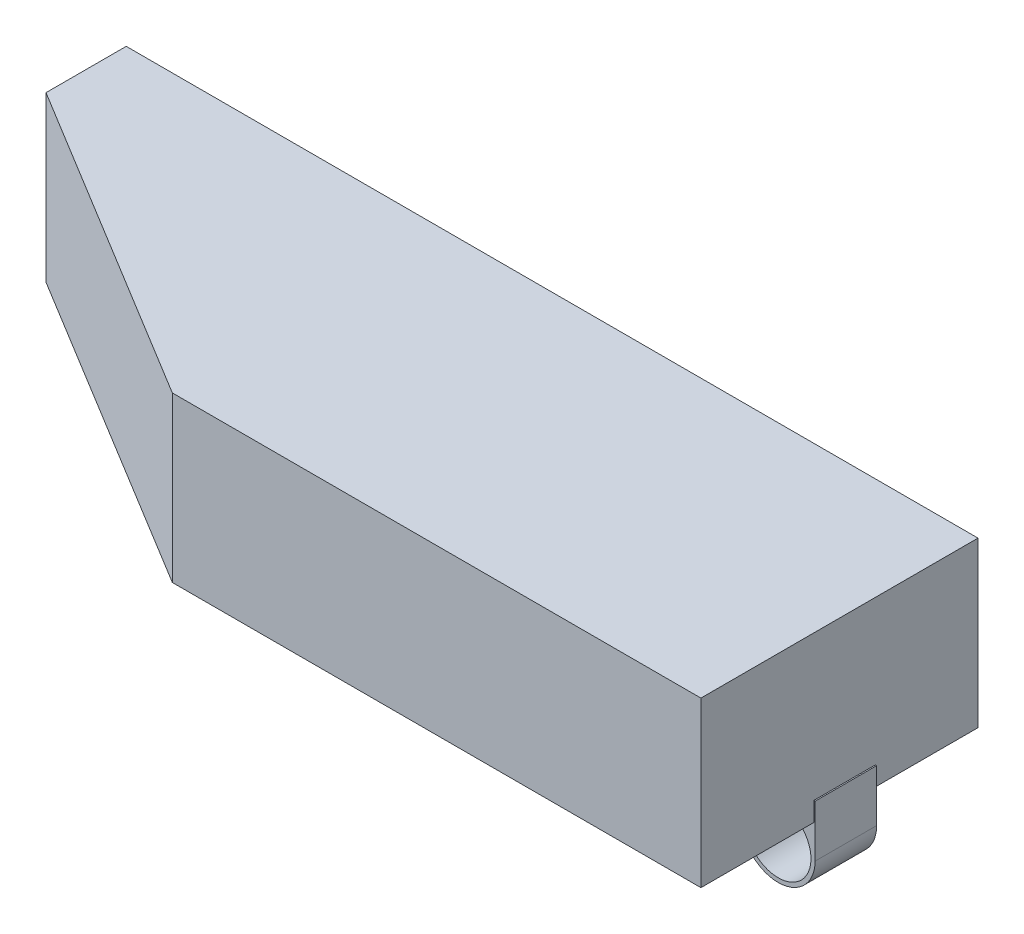
ISO-10303-21;
HEADER;
FILE_DESCRIPTION(('STEP AP214'),'2;1');
FILE_NAME('part.step','',(''),(''),'','','');
FILE_SCHEMA(('AUTOMOTIVE_DESIGN { 1 0 10303 214 1 1 1 1 }'));
ENDSEC;
DATA;
#1=APPLICATION_CONTEXT('core data for automotive mechanical design processes');
#2=APPLICATION_PROTOCOL_DEFINITION('international standard','automotive_design',2000,#1);
#3=PRODUCT_CONTEXT('',#1,'mechanical');
#4=PRODUCT('Part','Part','',(#3));
#5=PRODUCT_RELATED_PRODUCT_CATEGORY('part','',(#4));
#6=PRODUCT_DEFINITION_FORMATION('','',#4);
#7=PRODUCT_DEFINITION_CONTEXT('part definition',#1,'design');
#8=PRODUCT_DEFINITION('design','',#6,#7);
#9=PRODUCT_DEFINITION_SHAPE('','',#8);
#10=(LENGTH_UNIT() NAMED_UNIT(*) SI_UNIT(.MILLI.,.METRE.));
#11=(NAMED_UNIT(*) PLANE_ANGLE_UNIT() SI_UNIT($,.RADIAN.));
#12=(NAMED_UNIT(*) SI_UNIT($,.STERADIAN.) SOLID_ANGLE_UNIT());
#13=UNCERTAINTY_MEASURE_WITH_UNIT(LENGTH_MEASURE(1.E-05),#10,'distance_accuracy_value','');
#14=(GEOMETRIC_REPRESENTATION_CONTEXT(3) GLOBAL_UNCERTAINTY_ASSIGNED_CONTEXT((#13)) GLOBAL_UNIT_ASSIGNED_CONTEXT((#10,
#11,#12)) REPRESENTATION_CONTEXT('',''));
#15=CARTESIAN_POINT('',(0.,0.,0.));
#16=DIRECTION('',(0.,0.,1.));
#17=DIRECTION('',(1.,0.,0.));
#18=AXIS2_PLACEMENT_3D('',#15,#16,#17);
#19=CARTESIAN_POINT('',(0.,0.,0.));
#20=DIRECTION('',(0.,-1.,0.));
#21=DIRECTION('',(0.,0.,-1.));
#22=AXIS2_PLACEMENT_3D('',#19,#20,#21);
#23=PLANE('',#22);
#24=DIRECTION('',(1.,0.,0.));
#25=VECTOR('',#24,1.);
#26=CARTESIAN_POINT('',(0.,0.,-55.));
#27=LINE('',#26,#25);
#28=CARTESIAN_POINT('',(-35.3807674556755,0.,-55.));
#29=VERTEX_POINT('',#28);
#30=CARTESIAN_POINT('',(-17.3807674556755,0.,-55.));
#31=VERTEX_POINT('',#30);
#32=EDGE_CURVE('E280',#29,#31,#27,.T.);
#33=ORIENTED_EDGE('',*,*,#32,.T.);
#34=CARTESIAN_POINT('',(0.,0.,-55.));
#35=VERTEX_POINT('',#34);
#36=EDGE_CURVE('E282',#31,#35,#27,.T.);
#37=ORIENTED_EDGE('',*,*,#36,.T.);
#38=DIRECTION('',(0.,0.,1.));
#39=VECTOR('',#38,1.);
#40=CARTESIAN_POINT('',(0.,0.,-135.));
#41=LINE('',#40,#39);
#42=CARTESIAN_POINT('',(0.,0.,0.));
#43=VERTEX_POINT('',#42);
#44=EDGE_CURVE('E253',#35,#43,#41,.T.);
#45=ORIENTED_EDGE('',*,*,#44,.T.);
#46=DIRECTION('',(0.999999999999678,0.,8.02427909192227E-07));
#47=VECTOR('',#46,1.);
#48=CARTESIAN_POINT('',(-257.534328512037,0.,-0.000206652732773205));
#49=LINE('',#48,#47);
#50=CARTESIAN_POINT('',(-257.534328512037,0.,-0.000206652732773205));
#51=VERTEX_POINT('',#50);
#52=EDGE_CURVE('E234',#51,#43,#49,.T.);
#53=ORIENTED_EDGE('',*,*,#52,.F.);
#54=DIRECTION('',(-0.854037132553677,0.,-0.520212049283264));
#55=VECTOR('',#54,1.);
#56=CARTESIAN_POINT('',(-257.534328512037,0.,-0.000206652732773205));
#57=LINE('',#56,#55);
#58=CARTESIAN_POINT('',(-415.,0.,-95.9158718318107));
#59=VERTEX_POINT('',#58);
#60=EDGE_CURVE('E238',#51,#59,#57,.T.);
#61=ORIENTED_EDGE('',*,*,#60,.T.);
#62=DIRECTION('',(0.,0.,-1.));
#63=VECTOR('',#62,1.);
#64=CARTESIAN_POINT('',(-415.,0.,-95.9158718318107));
#65=LINE('',#64,#63);
#66=CARTESIAN_POINT('',(-415.,0.,-135.));
#67=VERTEX_POINT('',#66);
#68=EDGE_CURVE('E259',#59,#67,#65,.T.);
#69=ORIENTED_EDGE('',*,*,#68,.T.);
#70=DIRECTION('',(1.,0.,0.));
#71=VECTOR('',#70,1.);
#72=CARTESIAN_POINT('',(-415.,0.,-135.));
#73=LINE('',#72,#71);
#74=CARTESIAN_POINT('',(0.,0.,-135.));
#75=VERTEX_POINT('',#74);
#76=EDGE_CURVE('E256',#67,#75,#73,.T.);
#77=ORIENTED_EDGE('',*,*,#76,.T.);
#78=CARTESIAN_POINT('',(0.,0.,-85.));
#79=VERTEX_POINT('',#78);
#80=EDGE_CURVE('E254',#75,#79,#41,.T.);
#81=ORIENTED_EDGE('',*,*,#80,.T.);
#82=DIRECTION('',(1.,0.,0.));
#83=VECTOR('',#82,1.);
#84=CARTESIAN_POINT('',(0.,0.,-85.));
#85=LINE('',#84,#83);
#86=CARTESIAN_POINT('',(-17.3807674556755,0.,-85.));
#87=VERTEX_POINT('',#86);
#88=EDGE_CURVE('E274',#87,#79,#85,.T.);
#89=ORIENTED_EDGE('',*,*,#88,.F.);
#90=CARTESIAN_POINT('',(-35.3807674556755,0.,-85.));
#91=VERTEX_POINT('',#90);
#92=EDGE_CURVE('E277',#91,#87,#85,.T.);
#93=ORIENTED_EDGE('',*,*,#92,.F.);
#94=DIRECTION('',(0.,0.,1.));
#95=VECTOR('',#94,1.);
#96=CARTESIAN_POINT('',(-35.3807674556755,0.,0.));
#97=LINE('',#96,#95);
#98=EDGE_CURVE('E278',#91,#29,#97,.T.);
#99=ORIENTED_EDGE('',*,*,#98,.T.);
#100=EDGE_LOOP('',(#33,#37,#45,#53,#61,#69,#77,#81,#89,#93,#99));
#101=FACE_BOUND('',#100,.T.);
#102=DIRECTION('',(0.,0.,1.));
#103=VECTOR('',#102,1.);
#104=CARTESIAN_POINT('',(-235.380767455611,0.,0.));
#105=LINE('',#104,#103);
#106=CARTESIAN_POINT('',(-235.380767455611,0.,-85.));
#107=VERTEX_POINT('',#106);
#108=CARTESIAN_POINT('',(-235.380767455611,0.,-55.));
#109=VERTEX_POINT('',#108);
#110=EDGE_CURVE('E289',#107,#109,#105,.T.);
#111=ORIENTED_EDGE('',*,*,#110,.T.);
#112=DIRECTION('',(1.,0.,0.));
#113=VECTOR('',#112,1.);
#114=CARTESIAN_POINT('',(0.,0.,-55.));
#115=LINE('',#114,#113);
#116=CARTESIAN_POINT('',(-217.380767455611,0.,-55.));
#117=VERTEX_POINT('',#116);
#118=EDGE_CURVE('E11',#109,#117,#115,.T.);
#119=ORIENTED_EDGE('',*,*,#118,.T.);
#120=CARTESIAN_POINT('',(-199.380767455611,0.,-55.));
#121=VERTEX_POINT('',#120);
#122=EDGE_CURVE('E47',#117,#121,#115,.T.);
#123=ORIENTED_EDGE('',*,*,#122,.T.);
#124=DIRECTION('',(0.,0.,-1.));
#125=VECTOR('',#124,1.);
#126=CARTESIAN_POINT('',(-199.380767455611,0.,0.));
#127=LINE('',#126,#125);
#128=CARTESIAN_POINT('',(-199.380767455611,0.,-85.));
#129=VERTEX_POINT('',#128);
#130=EDGE_CURVE('E290',#121,#129,#127,.T.);
#131=ORIENTED_EDGE('',*,*,#130,.T.);
#132=DIRECTION('',(1.,0.,0.));
#133=VECTOR('',#132,1.);
#134=CARTESIAN_POINT('',(0.,0.,-85.));
#135=LINE('',#134,#133);
#136=CARTESIAN_POINT('',(-217.380767455611,0.,-85.));
#137=VERTEX_POINT('',#136);
#138=EDGE_CURVE('E285',#137,#129,#135,.T.);
#139=ORIENTED_EDGE('',*,*,#138,.F.);
#140=EDGE_CURVE('E288',#107,#137,#135,.T.);
#141=ORIENTED_EDGE('',*,*,#140,.F.);
#142=EDGE_LOOP('',(#111,#119,#123,#131,#139,#141));
#143=FACE_BOUND('',#142,.T.);
#144=ADVANCED_FACE('F43',(#101,#143),#23,.T.);
#145=CARTESIAN_POINT('',(0.,80.,-135.));
#146=DIRECTION('',(1.,0.,0.));
#147=DIRECTION('',(0.,0.,-1.));
#148=AXIS2_PLACEMENT_3D('',#145,#146,#147);
#149=PLANE('',#148);
#150=ORIENTED_EDGE('',*,*,#44,.F.);
#151=DIRECTION('',(0.,1.,0.));
#152=VECTOR('',#151,1.);
#153=CARTESIAN_POINT('',(0.,80.,-55.));
#154=LINE('',#153,#152);
#155=CARTESIAN_POINT('',(0.,9.30766354136547,-55.));
#156=VERTEX_POINT('',#155);
#157=EDGE_CURVE('E232',#35,#156,#154,.T.);
#158=ORIENTED_EDGE('',*,*,#157,.T.);
#159=DIRECTION('',(0.,0.,-1.));
#160=VECTOR('',#159,1.);
#161=CARTESIAN_POINT('',(0.,9.30766354136547,-135.));
#162=LINE('',#161,#160);
#163=CARTESIAN_POINT('',(0.,9.30766354136547,-85.));
#164=VERTEX_POINT('',#163);
#165=EDGE_CURVE('E283',#156,#164,#162,.T.);
#166=ORIENTED_EDGE('',*,*,#165,.T.);
#167=DIRECTION('',(0.,1.,0.));
#168=VECTOR('',#167,1.);
#169=CARTESIAN_POINT('',(0.,80.,-85.));
#170=LINE('',#169,#168);
#171=EDGE_CURVE('E225',#79,#164,#170,.T.);
#172=ORIENTED_EDGE('',*,*,#171,.F.);
#173=ORIENTED_EDGE('',*,*,#80,.F.);
#174=DIRECTION('',(0.,-1.,0.));
#175=VECTOR('',#174,1.);
#176=CARTESIAN_POINT('',(0.,80.,-135.));
#177=LINE('',#176,#175);
#178=CARTESIAN_POINT('',(0.,80.,-135.));
#179=VERTEX_POINT('',#178);
#180=EDGE_CURVE('E269',#179,#75,#177,.T.);
#181=ORIENTED_EDGE('',*,*,#180,.F.);
#182=DIRECTION('',(0.,0.,1.));
#183=VECTOR('',#182,1.);
#184=CARTESIAN_POINT('',(0.,80.,-135.));
#185=LINE('',#184,#183);
#186=CARTESIAN_POINT('',(0.,80.,0.));
#187=VERTEX_POINT('',#186);
#188=EDGE_CURVE('E237',#179,#187,#185,.T.);
#189=ORIENTED_EDGE('',*,*,#188,.T.);
#190=DIRECTION('',(0.,-1.,0.));
#191=VECTOR('',#190,1.);
#192=CARTESIAN_POINT('',(0.,80.,0.));
#193=LINE('',#192,#191);
#194=EDGE_CURVE('E271',#187,#43,#193,.T.);
#195=ORIENTED_EDGE('',*,*,#194,.T.);
#196=EDGE_LOOP('',(#150,#158,#166,#172,#173,#181,#189,#195));
#197=FACE_BOUND('',#196,.T.);
#198=ADVANCED_FACE('F313',(#197),#149,.T.);
#199=CARTESIAN_POINT('',(-257.534328512037,80.,-0.000206652732773205));
#200=DIRECTION('',(8.02427909192227E-07,0.,-0.999999999999678));
#201=DIRECTION('',(-0.999999999999678,0.,-8.02427909192227E-07));
#202=AXIS2_PLACEMENT_3D('',#199,#200,#201);
#203=PLANE('',#202);
#204=ORIENTED_EDGE('',*,*,#52,.T.);
#205=ORIENTED_EDGE('',*,*,#194,.F.);
#206=DIRECTION('',(0.999999999999678,0.,8.02427909192227E-07));
#207=VECTOR('',#206,1.);
#208=CARTESIAN_POINT('',(-257.534328512037,80.,-0.000206652732773205));
#209=LINE('',#208,#207);
#210=CARTESIAN_POINT('',(-257.534328512037,80.,-0.000206652732773205));
#211=VERTEX_POINT('',#210);
#212=EDGE_CURVE('E235',#211,#187,#209,.T.);
#213=ORIENTED_EDGE('',*,*,#212,.F.);
#214=DIRECTION('',(0.,-1.,0.));
#215=VECTOR('',#214,1.);
#216=CARTESIAN_POINT('',(-257.534328512037,80.,-0.000206652732773205));
#217=LINE('',#216,#215);
#218=EDGE_CURVE('E250',#211,#51,#217,.T.);
#219=ORIENTED_EDGE('',*,*,#218,.T.);
#220=EDGE_LOOP('',(#204,#205,#213,#219));
#221=FACE_BOUND('',#220,.T.);
#222=ADVANCED_FACE('F45',(#221),#203,.F.);
#223=CARTESIAN_POINT('',(-415.,80.,-135.));
#224=DIRECTION('',(0.,0.,-1.));
#225=DIRECTION('',(-1.,0.,0.));
#226=AXIS2_PLACEMENT_3D('',#223,#224,#225);
#227=PLANE('',#226);
#228=ORIENTED_EDGE('',*,*,#76,.F.);
#229=DIRECTION('',(0.,-1.,0.));
#230=VECTOR('',#229,1.);
#231=CARTESIAN_POINT('',(-415.,80.,-135.));
#232=LINE('',#231,#230);
#233=CARTESIAN_POINT('',(-415.,80.,-135.));
#234=VERTEX_POINT('',#233);
#235=EDGE_CURVE('E267',#234,#67,#232,.T.);
#236=ORIENTED_EDGE('',*,*,#235,.F.);
#237=DIRECTION('',(1.,0.,0.));
#238=VECTOR('',#237,1.);
#239=CARTESIAN_POINT('',(-415.,80.,-135.));
#240=LINE('',#239,#238);
#241=EDGE_CURVE('E241',#234,#179,#240,.T.);
#242=ORIENTED_EDGE('',*,*,#241,.T.);
#243=ORIENTED_EDGE('',*,*,#180,.T.);
#244=EDGE_LOOP('',(#228,#236,#242,#243));
#245=FACE_BOUND('',#244,.T.);
#246=ADVANCED_FACE('F332',(#245),#227,.T.);
#247=CARTESIAN_POINT('',(-415.,80.,-95.9158718318107));
#248=DIRECTION('',(-1.,0.,0.));
#249=DIRECTION('',(0.,0.,1.));
#250=AXIS2_PLACEMENT_3D('',#247,#248,#249);
#251=PLANE('',#250);
#252=ORIENTED_EDGE('',*,*,#68,.F.);
#253=DIRECTION('',(0.,-1.,0.));
#254=VECTOR('',#253,1.);
#255=CARTESIAN_POINT('',(-415.,80.,-95.9158718318107));
#256=LINE('',#255,#254);
#257=CARTESIAN_POINT('',(-415.,80.,-95.9158718318107));
#258=VERTEX_POINT('',#257);
#259=EDGE_CURVE('E265',#258,#59,#256,.T.);
#260=ORIENTED_EDGE('',*,*,#259,.F.);
#261=DIRECTION('',(0.,0.,-1.));
#262=VECTOR('',#261,1.);
#263=CARTESIAN_POINT('',(-415.,80.,-95.9158718318107));
#264=LINE('',#263,#262);
#265=EDGE_CURVE('E244',#258,#234,#264,.T.);
#266=ORIENTED_EDGE('',*,*,#265,.T.);
#267=ORIENTED_EDGE('',*,*,#235,.T.);
#268=EDGE_LOOP('',(#252,#260,#266,#267));
#269=FACE_BOUND('',#268,.T.);
#270=ADVANCED_FACE('F328',(#269),#251,.T.);
#271=CARTESIAN_POINT('',(-257.534328512037,80.,-0.000206652732773205));
#272=DIRECTION('',(-0.520212049283264,0.,0.854037132553677));
#273=DIRECTION('',(0.854037132553677,0.,0.520212049283264));
#274=AXIS2_PLACEMENT_3D('',#271,#272,#273);
#275=PLANE('',#274);
#276=ORIENTED_EDGE('',*,*,#60,.F.);
#277=ORIENTED_EDGE('',*,*,#218,.F.);
#278=DIRECTION('',(-0.854037132553677,0.,-0.520212049283264));
#279=VECTOR('',#278,1.);
#280=CARTESIAN_POINT('',(-257.534328512037,80.,-0.000206652732773205));
#281=LINE('',#280,#279);
#282=EDGE_CURVE('E247',#211,#258,#281,.T.);
#283=ORIENTED_EDGE('',*,*,#282,.T.);
#284=ORIENTED_EDGE('',*,*,#259,.T.);
#285=EDGE_LOOP('',(#276,#277,#283,#284));
#286=FACE_BOUND('',#285,.T.);
#287=ADVANCED_FACE('F325',(#286),#275,.T.);
#288=CARTESIAN_POINT('',(0.,80.,0.));
#289=DIRECTION('',(0.,-1.,0.));
#290=DIRECTION('',(0.,0.,-1.));
#291=AXIS2_PLACEMENT_3D('',#288,#289,#290);
#292=PLANE('',#291);
#293=ORIENTED_EDGE('',*,*,#212,.T.);
#294=ORIENTED_EDGE('',*,*,#188,.F.);
#295=ORIENTED_EDGE('',*,*,#241,.F.);
#296=ORIENTED_EDGE('',*,*,#265,.F.);
#297=ORIENTED_EDGE('',*,*,#282,.F.);
#298=EDGE_LOOP('',(#293,#294,#295,#296,#297));
#299=FACE_BOUND('',#298,.T.);
#300=ADVANCED_FACE('F323',(#299),#292,.F.);
#301=CARTESIAN_POINT('',(-35.3807674556755,0.,-55.));
#302=DIRECTION('',(1.,0.,0.));
#303=DIRECTION('',(0.,0.,-1.));
#304=AXIS2_PLACEMENT_3D('',#301,#302,#303);
#305=PLANE('',#304);
#306=ORIENTED_EDGE('',*,*,#98,.F.);
#307=DIRECTION('',(0.,-1.,0.));
#308=VECTOR('',#307,1.);
#309=CARTESIAN_POINT('',(-35.3807674556755,0.,-85.));
#310=LINE('',#309,#308);
#311=CARTESIAN_POINT('',(-35.3807674556755,-16.,-85.));
#312=VERTEX_POINT('',#311);
#313=EDGE_CURVE('E213',#91,#312,#310,.T.);
#314=ORIENTED_EDGE('',*,*,#313,.T.);
#315=DIRECTION('',(0.,0.,-1.));
#316=VECTOR('',#315,1.);
#317=CARTESIAN_POINT('',(-35.3807674556755,-16.,-55.));
#318=LINE('',#317,#316);
#319=CARTESIAN_POINT('',(-35.3807674556755,-16.,-55.));
#320=VERTEX_POINT('',#319);
#321=EDGE_CURVE('E222',#320,#312,#318,.T.);
#322=ORIENTED_EDGE('',*,*,#321,.F.);
#323=DIRECTION('',(0.,-1.,0.));
#324=VECTOR('',#323,1.);
#325=CARTESIAN_POINT('',(-35.3807674556755,0.,-55.));
#326=LINE('',#325,#324);
#327=EDGE_CURVE('E199',#29,#320,#326,.T.);
#328=ORIENTED_EDGE('',*,*,#327,.F.);
#329=EDGE_LOOP('',(#306,#314,#322,#328));
#330=FACE_BOUND('',#329,.T.);
#331=ADVANCED_FACE('F387',(#330),#305,.F.);
#332=CARTESIAN_POINT('',(-17.3807674556755,-16.,-55.));
#333=DIRECTION('',(0.,0.,-1.));
#334=DIRECTION('',(-1.,0.,0.));
#335=AXIS2_PLACEMENT_3D('',#332,#333,#334);
#336=CYLINDRICAL_SURFACE('',#335,18.);
#337=CARTESIAN_POINT('',(-17.3807674556755,-16.,-85.));
#338=DIRECTION('',(0.,0.,-1.));
#339=DIRECTION('',(-1.,0.,0.));
#340=AXIS2_PLACEMENT_3D('',#337,#338,#339);
#341=CIRCLE('',#340,18.);
#342=CARTESIAN_POINT('',(0.619232544324545,-16.,-85.));
#343=VERTEX_POINT('',#342);
#344=EDGE_CURVE('E200',#343,#312,#341,.T.);
#345=ORIENTED_EDGE('',*,*,#344,.F.);
#346=DIRECTION('',(0.,0.,-1.));
#347=VECTOR('',#346,1.);
#348=CARTESIAN_POINT('',(0.619232544324545,-16.,-55.));
#349=LINE('',#348,#347);
#350=CARTESIAN_POINT('',(0.619232544324545,-16.,-55.));
#351=VERTEX_POINT('',#350);
#352=EDGE_CURVE('E226',#351,#343,#349,.T.);
#353=ORIENTED_EDGE('',*,*,#352,.F.);
#354=CARTESIAN_POINT('',(-17.3807674556755,-16.,-55.));
#355=DIRECTION('',(0.,0.,-1.));
#356=DIRECTION('',(-1.,0.,0.));
#357=AXIS2_PLACEMENT_3D('',#354,#355,#356);
#358=CIRCLE('',#357,18.);
#359=EDGE_CURVE('E207',#351,#320,#358,.T.);
#360=ORIENTED_EDGE('',*,*,#359,.T.);
#361=ORIENTED_EDGE('',*,*,#321,.T.);
#362=EDGE_LOOP('',(#345,#353,#360,#361));
#363=FACE_BOUND('',#362,.T.);
#364=ADVANCED_FACE('F384',(#363),#336,.T.);
#365=CARTESIAN_POINT('',(0.619232544324545,0.,-55.));
#366=DIRECTION('',(-1.,0.,0.));
#367=DIRECTION('',(0.,0.,1.));
#368=AXIS2_PLACEMENT_3D('',#365,#366,#367);
#369=PLANE('',#368);
#370=DIRECTION('',(0.,1.,0.));
#371=VECTOR('',#370,1.);
#372=CARTESIAN_POINT('',(0.619232544324545,0.,-85.));
#373=LINE('',#372,#371);
#374=CARTESIAN_POINT('',(0.619232544324545,9.30766354136547,-85.));
#375=VERTEX_POINT('',#374);
#376=EDGE_CURVE('E218',#343,#375,#373,.T.);
#377=ORIENTED_EDGE('',*,*,#376,.T.);
#378=DIRECTION('',(0.,0.,-1.));
#379=VECTOR('',#378,1.);
#380=CARTESIAN_POINT('',(0.619232544324545,9.30766354136547,-55.));
#381=LINE('',#380,#379);
#382=CARTESIAN_POINT('',(0.619232544324545,9.30766354136547,-55.));
#383=VERTEX_POINT('',#382);
#384=EDGE_CURVE('E210',#383,#375,#381,.T.);
#385=ORIENTED_EDGE('',*,*,#384,.F.);
#386=DIRECTION('',(0.,1.,0.));
#387=VECTOR('',#386,1.);
#388=CARTESIAN_POINT('',(0.619232544324545,0.,-55.));
#389=LINE('',#388,#387);
#390=EDGE_CURVE('E205',#351,#383,#389,.T.);
#391=ORIENTED_EDGE('',*,*,#390,.F.);
#392=ORIENTED_EDGE('',*,*,#352,.T.);
#393=EDGE_LOOP('',(#377,#385,#391,#392));
#394=FACE_BOUND('',#393,.T.);
#395=ADVANCED_FACE('F365',(#394),#369,.F.);
#396=CARTESIAN_POINT('',(-17.3807674556755,-16.,-55.));
#397=DIRECTION('',(0.,0.,-1.));
#398=DIRECTION('',(-1.,0.,0.));
#399=AXIS2_PLACEMENT_3D('',#396,#397,#398);
#400=CYLINDRICAL_SURFACE('',#399,16.);
#401=CARTESIAN_POINT('',(-17.3807674556755,-16.,-85.));
#402=DIRECTION('',(0.,0.,-1.));
#403=DIRECTION('',(-1.,0.,0.));
#404=AXIS2_PLACEMENT_3D('',#401,#402,#403);
#405=CIRCLE('',#404,16.);
#406=EDGE_CURVE('E194',#87,#87,#405,.T.);
#407=ORIENTED_EDGE('',*,*,#406,.T.);
#408=EDGE_LOOP('',(#407));
#409=FACE_BOUND('',#408,.T.);
#410=CARTESIAN_POINT('',(-17.3807674556755,-16.,-55.));
#411=DIRECTION('',(0.,0.,-1.));
#412=DIRECTION('',(-1.,0.,0.));
#413=AXIS2_PLACEMENT_3D('',#410,#411,#412);
#414=CIRCLE('',#413,16.);
#415=EDGE_CURVE('E196',#31,#31,#414,.T.);
#416=ORIENTED_EDGE('',*,*,#415,.F.);
#417=EDGE_LOOP('',(#416));
#418=FACE_BOUND('',#417,.T.);
#419=ADVANCED_FACE('F361',(#409,#418),#400,.F.);
#420=CARTESIAN_POINT('',(0.,9.30766354136547,-55.));
#421=DIRECTION('',(0.,-1.,0.));
#422=DIRECTION('',(0.,0.,-1.));
#423=AXIS2_PLACEMENT_3D('',#420,#421,#422);
#424=PLANE('',#423);
#425=ORIENTED_EDGE('',*,*,#165,.F.);
#426=DIRECTION('',(-1.,0.,0.));
#427=VECTOR('',#426,1.);
#428=CARTESIAN_POINT('',(0.,9.30766354136547,-55.));
#429=LINE('',#428,#427);
#430=EDGE_CURVE('E202',#383,#156,#429,.T.);
#431=ORIENTED_EDGE('',*,*,#430,.F.);
#432=ORIENTED_EDGE('',*,*,#384,.T.);
#433=DIRECTION('',(-1.,0.,0.));
#434=VECTOR('',#433,1.);
#435=CARTESIAN_POINT('',(0.,9.30766354136547,-85.));
#436=LINE('',#435,#434);
#437=EDGE_CURVE('E215',#375,#164,#436,.T.);
#438=ORIENTED_EDGE('',*,*,#437,.T.);
#439=EDGE_LOOP('',(#425,#431,#432,#438));
#440=FACE_BOUND('',#439,.T.);
#441=ADVANCED_FACE('F364',(#440),#424,.F.);
#442=CARTESIAN_POINT('',(0.,0.,-55.));
#443=DIRECTION('',(0.,0.,-1.));
#444=DIRECTION('',(-1.,0.,0.));
#445=AXIS2_PLACEMENT_3D('',#442,#443,#444);
#446=PLANE('',#445);
#447=ORIENTED_EDGE('',*,*,#157,.F.);
#448=ORIENTED_EDGE('',*,*,#36,.F.);
#449=ORIENTED_EDGE('',*,*,#415,.T.);
#450=ORIENTED_EDGE('',*,*,#32,.F.);
#451=ORIENTED_EDGE('',*,*,#327,.T.);
#452=ORIENTED_EDGE('',*,*,#359,.F.);
#453=ORIENTED_EDGE('',*,*,#390,.T.);
#454=ORIENTED_EDGE('',*,*,#430,.T.);
#455=EDGE_LOOP('',(#447,#448,#449,#450,#451,#452,#453,#454));
#456=FACE_BOUND('',#455,.T.);
#457=ADVANCED_FACE('F371',(#456),#446,.F.);
#458=CARTESIAN_POINT('',(0.,0.,-85.));
#459=DIRECTION('',(0.,0.,-1.));
#460=DIRECTION('',(-1.,0.,0.));
#461=AXIS2_PLACEMENT_3D('',#458,#459,#460);
#462=PLANE('',#461);
#463=ORIENTED_EDGE('',*,*,#88,.T.);
#464=ORIENTED_EDGE('',*,*,#171,.T.);
#465=ORIENTED_EDGE('',*,*,#437,.F.);
#466=ORIENTED_EDGE('',*,*,#376,.F.);
#467=ORIENTED_EDGE('',*,*,#344,.T.);
#468=ORIENTED_EDGE('',*,*,#313,.F.);
#469=ORIENTED_EDGE('',*,*,#92,.T.);
#470=ORIENTED_EDGE('',*,*,#406,.F.);
#471=EDGE_LOOP('',(#463,#464,#465,#466,#467,#468,#469,#470));
#472=FACE_BOUND('',#471,.T.);
#473=ADVANCED_FACE('F359',(#472),#462,.T.);
#474=CARTESIAN_POINT('',(-217.380767455611,-16.,-55.));
#475=DIRECTION('',(0.,0.,-1.));
#476=DIRECTION('',(-1.,0.,0.));
#477=AXIS2_PLACEMENT_3D('',#474,#475,#476);
#478=CYLINDRICAL_SURFACE('',#477,18.);
#479=CARTESIAN_POINT('',(-217.380767455611,-16.,-85.));
#480=DIRECTION('',(0.,0.,-1.));
#481=DIRECTION('',(-1.,0.,0.));
#482=AXIS2_PLACEMENT_3D('',#479,#480,#481);
#483=CIRCLE('',#482,18.);
#484=CARTESIAN_POINT('',(-199.380767455611,-16.,-85.));
#485=VERTEX_POINT('',#484);
#486=CARTESIAN_POINT('',(-235.380767455611,-16.,-85.));
#487=VERTEX_POINT('',#486);
#488=EDGE_CURVE('E189',#485,#487,#483,.T.);
#489=ORIENTED_EDGE('',*,*,#488,.F.);
#490=DIRECTION('',(0.,0.,-1.));
#491=VECTOR('',#490,1.);
#492=CARTESIAN_POINT('',(-199.380767455611,-16.,-55.));
#493=LINE('',#492,#491);
#494=CARTESIAN_POINT('',(-199.380767455611,-16.,-55.));
#495=VERTEX_POINT('',#494);
#496=EDGE_CURVE('E176',#495,#485,#493,.T.);
#497=ORIENTED_EDGE('',*,*,#496,.F.);
#498=CARTESIAN_POINT('',(-217.380767455611,-16.,-55.));
#499=DIRECTION('',(0.,0.,-1.));
#500=DIRECTION('',(-1.,0.,0.));
#501=AXIS2_PLACEMENT_3D('',#498,#499,#500);
#502=CIRCLE('',#501,18.);
#503=CARTESIAN_POINT('',(-235.380767455611,-16.,-55.));
#504=VERTEX_POINT('',#503);
#505=EDGE_CURVE('E162',#495,#504,#502,.T.);
#506=ORIENTED_EDGE('',*,*,#505,.T.);
#507=DIRECTION('',(0.,0.,-1.));
#508=VECTOR('',#507,1.);
#509=CARTESIAN_POINT('',(-235.380767455611,-16.,-55.));
#510=LINE('',#509,#508);
#511=EDGE_CURVE('E169',#504,#487,#510,.T.);
#512=ORIENTED_EDGE('',*,*,#511,.T.);
#513=EDGE_LOOP('',(#489,#497,#506,#512));
#514=FACE_BOUND('',#513,.T.);
#515=ADVANCED_FACE('F179',(#514),#478,.T.);
#516=CARTESIAN_POINT('',(-199.380767455611,0.,-55.));
#517=DIRECTION('',(-1.,0.,0.));
#518=DIRECTION('',(0.,0.,1.));
#519=AXIS2_PLACEMENT_3D('',#516,#517,#518);
#520=PLANE('',#519);
#521=ORIENTED_EDGE('',*,*,#130,.F.);
#522=DIRECTION('',(0.,1.,0.));
#523=VECTOR('',#522,1.);
#524=CARTESIAN_POINT('',(-199.380767455611,0.,-55.));
#525=LINE('',#524,#523);
#526=EDGE_CURVE('E166',#495,#121,#525,.T.);
#527=ORIENTED_EDGE('',*,*,#526,.F.);
#528=ORIENTED_EDGE('',*,*,#496,.T.);
#529=DIRECTION('',(0.,1.,0.));
#530=VECTOR('',#529,1.);
#531=CARTESIAN_POINT('',(-199.380767455611,0.,-85.));
#532=LINE('',#531,#530);
#533=EDGE_CURVE('E184',#485,#129,#532,.T.);
#534=ORIENTED_EDGE('',*,*,#533,.T.);
#535=EDGE_LOOP('',(#521,#527,#528,#534));
#536=FACE_BOUND('',#535,.T.);
#537=ADVANCED_FACE('F297',(#536),#520,.F.);
#538=CARTESIAN_POINT('',(-235.380767455611,0.,-55.));
#539=DIRECTION('',(1.,0.,0.));
#540=DIRECTION('',(0.,0.,-1.));
#541=AXIS2_PLACEMENT_3D('',#538,#539,#540);
#542=PLANE('',#541);
#543=ORIENTED_EDGE('',*,*,#110,.F.);
#544=DIRECTION('',(0.,-1.,0.));
#545=VECTOR('',#544,1.);
#546=CARTESIAN_POINT('',(-235.380767455611,0.,-85.));
#547=LINE('',#546,#545);
#548=EDGE_CURVE('E172',#107,#487,#547,.T.);
#549=ORIENTED_EDGE('',*,*,#548,.T.);
#550=ORIENTED_EDGE('',*,*,#511,.F.);
#551=DIRECTION('',(0.,-1.,0.));
#552=VECTOR('',#551,1.);
#553=CARTESIAN_POINT('',(-235.380767455611,0.,-55.));
#554=LINE('',#553,#552);
#555=EDGE_CURVE('E157',#109,#504,#554,.T.);
#556=ORIENTED_EDGE('',*,*,#555,.F.);
#557=EDGE_LOOP('',(#543,#549,#550,#556));
#558=FACE_BOUND('',#557,.T.);
#559=ADVANCED_FACE('F170',(#558),#542,.F.);
#560=CARTESIAN_POINT('',(-217.380767455611,-16.,-55.));
#561=DIRECTION('',(0.,0.,-1.));
#562=DIRECTION('',(-1.,0.,0.));
#563=AXIS2_PLACEMENT_3D('',#560,#561,#562);
#564=CYLINDRICAL_SURFACE('',#563,16.);
#565=CARTESIAN_POINT('',(-217.380767455611,-16.,-85.));
#566=DIRECTION('',(0.,0.,-1.));
#567=DIRECTION('',(-1.,0.,0.));
#568=AXIS2_PLACEMENT_3D('',#565,#566,#567);
#569=CIRCLE('',#568,16.);
#570=EDGE_CURVE('E181',#137,#137,#569,.T.);
#571=ORIENTED_EDGE('',*,*,#570,.T.);
#572=EDGE_LOOP('',(#571));
#573=FACE_BOUND('',#572,.T.);
#574=CARTESIAN_POINT('',(-217.380767455611,-16.,-55.));
#575=DIRECTION('',(0.,0.,-1.));
#576=DIRECTION('',(-1.,0.,0.));
#577=AXIS2_PLACEMENT_3D('',#574,#575,#576);
#578=CIRCLE('',#577,16.);
#579=EDGE_CURVE('E177',#117,#117,#578,.T.);
#580=ORIENTED_EDGE('',*,*,#579,.F.);
#581=EDGE_LOOP('',(#580));
#582=FACE_BOUND('',#581,.T.);
#583=ADVANCED_FACE('F300',(#573,#582),#564,.F.);
#584=CARTESIAN_POINT('',(0.,0.,-55.));
#585=DIRECTION('',(0.,0.,-1.));
#586=DIRECTION('',(-1.,0.,0.));
#587=AXIS2_PLACEMENT_3D('',#584,#585,#586);
#588=PLANE('',#587);
#589=ORIENTED_EDGE('',*,*,#118,.F.);
#590=ORIENTED_EDGE('',*,*,#555,.T.);
#591=ORIENTED_EDGE('',*,*,#505,.F.);
#592=ORIENTED_EDGE('',*,*,#526,.T.);
#593=ORIENTED_EDGE('',*,*,#122,.F.);
#594=ORIENTED_EDGE('',*,*,#579,.T.);
#595=EDGE_LOOP('',(#589,#590,#591,#592,#593,#594));
#596=FACE_BOUND('',#595,.T.);
#597=ADVANCED_FACE('F159',(#596),#588,.F.);
#598=CARTESIAN_POINT('',(0.,0.,-85.));
#599=DIRECTION('',(0.,0.,-1.));
#600=DIRECTION('',(-1.,0.,0.));
#601=AXIS2_PLACEMENT_3D('',#598,#599,#600);
#602=PLANE('',#601);
#603=ORIENTED_EDGE('',*,*,#548,.F.);
#604=ORIENTED_EDGE('',*,*,#140,.T.);
#605=ORIENTED_EDGE('',*,*,#570,.F.);
#606=ORIENTED_EDGE('',*,*,#138,.T.);
#607=ORIENTED_EDGE('',*,*,#533,.F.);
#608=ORIENTED_EDGE('',*,*,#488,.T.);
#609=EDGE_LOOP('',(#603,#604,#605,#606,#607,#608));
#610=FACE_BOUND('',#609,.T.);
#611=ADVANCED_FACE('F296',(#610),#602,.T.);
#612=CLOSED_SHELL('',(#144,#198,#222,#246,#270,#287,#300,#331,#364,#395,#419,#441,#457,#473,
#515,#537,#559,#583,#597,#611));
#613=MANIFOLD_SOLID_BREP('B2',#612);
#614=ADVANCED_BREP_SHAPE_REPRESENTATION('',(#18,#613),#14);
#615=SHAPE_DEFINITION_REPRESENTATION(#9,#614);
ENDSEC;
END-ISO-10303-21;
